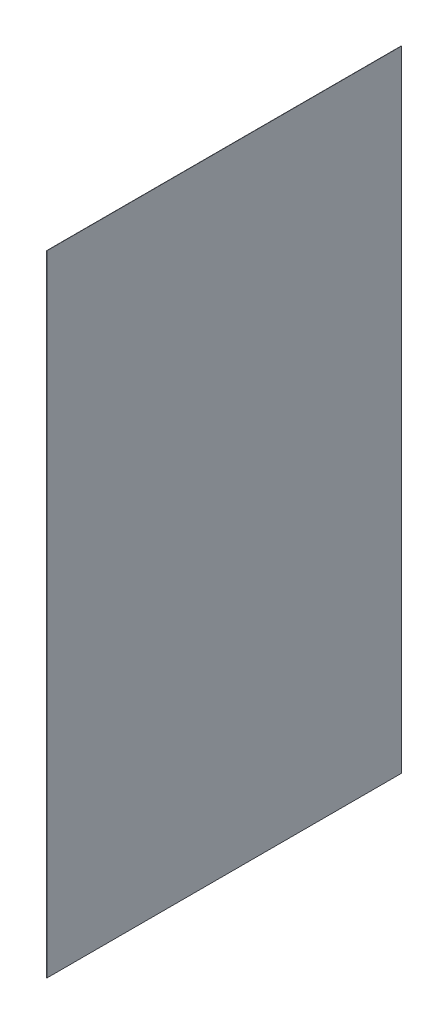
ISO-10303-21;
HEADER;
FILE_DESCRIPTION(('STEP AP214'),'2;1');
FILE_NAME('part.step','',(''),(''),'','','');
FILE_SCHEMA(('AUTOMOTIVE_DESIGN { 1 0 10303 214 1 1 1 1 }'));
ENDSEC;
DATA;
#1=APPLICATION_CONTEXT('core data for automotive mechanical design processes');
#2=APPLICATION_PROTOCOL_DEFINITION('international standard','automotive_design',2000,#1);
#3=PRODUCT_CONTEXT('',#1,'mechanical');
#4=PRODUCT('Part','Part','',(#3));
#5=PRODUCT_RELATED_PRODUCT_CATEGORY('part','',(#4));
#6=PRODUCT_DEFINITION_FORMATION('','',#4);
#7=PRODUCT_DEFINITION_CONTEXT('part definition',#1,'design');
#8=PRODUCT_DEFINITION('design','',#6,#7);
#9=PRODUCT_DEFINITION_SHAPE('','',#8);
#10=(LENGTH_UNIT() NAMED_UNIT(*) SI_UNIT(.MILLI.,.METRE.));
#11=(NAMED_UNIT(*) PLANE_ANGLE_UNIT() SI_UNIT($,.RADIAN.));
#12=(NAMED_UNIT(*) SI_UNIT($,.STERADIAN.) SOLID_ANGLE_UNIT());
#13=UNCERTAINTY_MEASURE_WITH_UNIT(LENGTH_MEASURE(1.E-05),#10,'distance_accuracy_value','');
#14=(GEOMETRIC_REPRESENTATION_CONTEXT(3) GLOBAL_UNCERTAINTY_ASSIGNED_CONTEXT((#13)) GLOBAL_UNIT_ASSIGNED_CONTEXT((#10,
#11,#12)) REPRESENTATION_CONTEXT('',''));
#15=CARTESIAN_POINT('',(0.,0.,0.));
#16=DIRECTION('',(0.,0.,1.));
#17=DIRECTION('',(1.,0.,0.));
#18=AXIS2_PLACEMENT_3D('',#15,#16,#17);
#19=CARTESIAN_POINT('',(3153.26864497358,0.,0.));
#20=DIRECTION('',(1.,0.,0.));
#21=DIRECTION('',(0.,0.,-1.));
#22=AXIS2_PLACEMENT_3D('',#19,#20,#21);
#23=PLANE('',#22);
#24=DIRECTION('',(0.,0.,-1.));
#25=VECTOR('',#24,1.);
#26=CARTESIAN_POINT('',(3153.26864497358,1435.21545454545,807.442909090909));
#27=LINE('',#26,#25);
#28=CARTESIAN_POINT('',(3153.26864497358,1435.21545454545,807.442909090909));
#29=VERTEX_POINT('',#28);
#30=CARTESIAN_POINT('',(3153.26864497358,1435.21545454545,-807.4429090909));
#31=VERTEX_POINT('',#30);
#32=EDGE_CURVE('E43',#29,#31,#27,.T.);
#33=ORIENTED_EDGE('',*,*,#32,.F.);
#34=DIRECTION('',(0.,1.,0.));
#35=VECTOR('',#34,1.);
#36=CARTESIAN_POINT('',(3153.26864497358,1435.21545454545,807.442909090909));
#37=LINE('',#36,#35);
#38=CARTESIAN_POINT('',(3153.26864497358,-1435.21545454546,807.442909090909));
#39=VERTEX_POINT('',#38);
#40=EDGE_CURVE('E74',#39,#29,#37,.T.);
#41=ORIENTED_EDGE('',*,*,#40,.F.);
#42=DIRECTION('',(0.,0.,1.));
#43=VECTOR('',#42,1.);
#44=CARTESIAN_POINT('',(3153.26864497358,-1435.21545454546,807.442909090909));
#45=LINE('',#44,#43);
#46=CARTESIAN_POINT('',(3153.26864497358,-1435.21545454546,-807.4429090909));
#47=VERTEX_POINT('',#46);
#48=EDGE_CURVE('E81',#47,#39,#45,.T.);
#49=ORIENTED_EDGE('',*,*,#48,.F.);
#50=DIRECTION('',(0.,-1.,0.));
#51=VECTOR('',#50,1.);
#52=CARTESIAN_POINT('',(3153.26864497358,1435.21545454545,-807.4429090909));
#53=LINE('',#52,#51);
#54=EDGE_CURVE('E104',#31,#47,#53,.T.);
#55=ORIENTED_EDGE('',*,*,#54,.F.);
#56=EDGE_LOOP('',(#33,#41,#49,#55));
#57=FACE_BOUND('',#56,.T.);
#58=ADVANCED_FACE('F34',(#57),#23,.T.);
#59=CARTESIAN_POINT('',(3152.26864497358,0.,0.));
#60=DIRECTION('',(1.,0.,0.));
#61=DIRECTION('',(0.,0.,-1.));
#62=AXIS2_PLACEMENT_3D('',#59,#60,#61);
#63=PLANE('',#62);
#64=DIRECTION('',(0.,0.,-1.));
#65=VECTOR('',#64,1.);
#66=CARTESIAN_POINT('',(3152.26864497358,1435.21545454545,807.442909090909));
#67=LINE('',#66,#65);
#68=CARTESIAN_POINT('',(3152.26864497358,1435.21545454545,807.442909090909));
#69=VERTEX_POINT('',#68);
#70=CARTESIAN_POINT('',(3152.26864497358,1435.21545454545,-807.4429090909));
#71=VERTEX_POINT('',#70);
#72=EDGE_CURVE('E12',#69,#71,#67,.T.);
#73=ORIENTED_EDGE('',*,*,#72,.T.);
#74=DIRECTION('',(0.,-1.,0.));
#75=VECTOR('',#74,1.);
#76=CARTESIAN_POINT('',(3152.26864497358,1435.21545454545,-807.4429090909));
#77=LINE('',#76,#75);
#78=CARTESIAN_POINT('',(3152.26864497358,-1435.21545454546,-807.4429090909));
#79=VERTEX_POINT('',#78);
#80=EDGE_CURVE('E52',#71,#79,#77,.T.);
#81=ORIENTED_EDGE('',*,*,#80,.T.);
#82=DIRECTION('',(0.,0.,1.));
#83=VECTOR('',#82,1.);
#84=CARTESIAN_POINT('',(3152.26864497358,-1435.21545454546,807.442909090909));
#85=LINE('',#84,#83);
#86=CARTESIAN_POINT('',(3152.26864497358,-1435.21545454546,807.442909090909));
#87=VERTEX_POINT('',#86);
#88=EDGE_CURVE('E107',#79,#87,#85,.T.);
#89=ORIENTED_EDGE('',*,*,#88,.T.);
#90=DIRECTION('',(0.,1.,0.));
#91=VECTOR('',#90,1.);
#92=CARTESIAN_POINT('',(3152.26864497358,1435.21545454545,807.442909090909));
#93=LINE('',#92,#91);
#94=EDGE_CURVE('E92',#87,#69,#93,.T.);
#95=ORIENTED_EDGE('',*,*,#94,.T.);
#96=EDGE_LOOP('',(#73,#81,#89,#95));
#97=FACE_BOUND('',#96,.T.);
#98=ADVANCED_FACE('F118',(#97),#63,.F.);
#99=CARTESIAN_POINT('',(3152.26864497358,1435.21545454545,807.442909090909));
#100=DIRECTION('',(0.,0.,-1.));
#101=DIRECTION('',(-1.,0.,0.));
#102=AXIS2_PLACEMENT_3D('',#99,#100,#101);
#103=PLANE('',#102);
#104=ORIENTED_EDGE('',*,*,#40,.T.);
#105=DIRECTION('',(1.,0.,0.));
#106=VECTOR('',#105,1.);
#107=CARTESIAN_POINT('',(3152.26864497358,1435.21545454545,807.442909090909));
#108=LINE('',#107,#106);
#109=EDGE_CURVE('E88',#69,#29,#108,.T.);
#110=ORIENTED_EDGE('',*,*,#109,.F.);
#111=ORIENTED_EDGE('',*,*,#94,.F.);
#112=DIRECTION('',(1.,0.,0.));
#113=VECTOR('',#112,1.);
#114=CARTESIAN_POINT('',(3152.26864497358,-1435.21545454546,807.442909090909));
#115=LINE('',#114,#113);
#116=EDGE_CURVE('E83',#87,#39,#115,.T.);
#117=ORIENTED_EDGE('',*,*,#116,.T.);
#118=EDGE_LOOP('',(#104,#110,#111,#117));
#119=FACE_BOUND('',#118,.T.);
#120=ADVANCED_FACE('F90',(#119),#103,.F.);
#121=CARTESIAN_POINT('',(3152.26864497358,-1435.21545454546,807.442909090909));
#122=DIRECTION('',(0.,1.,0.));
#123=DIRECTION('',(0.,0.,1.));
#124=AXIS2_PLACEMENT_3D('',#121,#122,#123);
#125=PLANE('',#124);
#126=ORIENTED_EDGE('',*,*,#48,.T.);
#127=ORIENTED_EDGE('',*,*,#116,.F.);
#128=ORIENTED_EDGE('',*,*,#88,.F.);
#129=DIRECTION('',(1.,0.,0.));
#130=VECTOR('',#129,1.);
#131=CARTESIAN_POINT('',(3152.26864497358,-1435.21545454546,-807.4429090909));
#132=LINE('',#131,#130);
#133=EDGE_CURVE('E85',#79,#47,#132,.T.);
#134=ORIENTED_EDGE('',*,*,#133,.T.);
#135=EDGE_LOOP('',(#126,#127,#128,#134));
#136=FACE_BOUND('',#135,.T.);
#137=ADVANCED_FACE('F82',(#136),#125,.F.);
#138=CARTESIAN_POINT('',(3152.26864497358,1435.21545454545,-807.4429090909));
#139=DIRECTION('',(0.,0.,1.));
#140=DIRECTION('',(1.,0.,0.));
#141=AXIS2_PLACEMENT_3D('',#138,#139,#140);
#142=PLANE('',#141);
#143=ORIENTED_EDGE('',*,*,#54,.T.);
#144=ORIENTED_EDGE('',*,*,#133,.F.);
#145=ORIENTED_EDGE('',*,*,#80,.F.);
#146=DIRECTION('',(1.,0.,0.));
#147=VECTOR('',#146,1.);
#148=CARTESIAN_POINT('',(3152.26864497358,1435.21545454545,-807.4429090909));
#149=LINE('',#148,#147);
#150=EDGE_CURVE('E106',#71,#31,#149,.T.);
#151=ORIENTED_EDGE('',*,*,#150,.T.);
#152=EDGE_LOOP('',(#143,#144,#145,#151));
#153=FACE_BOUND('',#152,.T.);
#154=ADVANCED_FACE('F119',(#153),#142,.F.);
#155=CARTESIAN_POINT('',(3152.26864497358,1435.21545454545,807.442909090909));
#156=DIRECTION('',(0.,-1.,0.));
#157=DIRECTION('',(0.,0.,-1.));
#158=AXIS2_PLACEMENT_3D('',#155,#156,#157);
#159=PLANE('',#158);
#160=ORIENTED_EDGE('',*,*,#32,.T.);
#161=ORIENTED_EDGE('',*,*,#150,.F.);
#162=ORIENTED_EDGE('',*,*,#72,.F.);
#163=ORIENTED_EDGE('',*,*,#109,.T.);
#164=EDGE_LOOP('',(#160,#161,#162,#163));
#165=FACE_BOUND('',#164,.T.);
#166=ADVANCED_FACE('F132',(#165),#159,.F.);
#167=CLOSED_SHELL('',(#58,#98,#120,#137,#154,#166));
#168=MANIFOLD_SOLID_BREP('B2',#167);
#169=ADVANCED_BREP_SHAPE_REPRESENTATION('',(#18,#168),#14);
#170=SHAPE_DEFINITION_REPRESENTATION(#9,#169);
ENDSEC;
END-ISO-10303-21;
